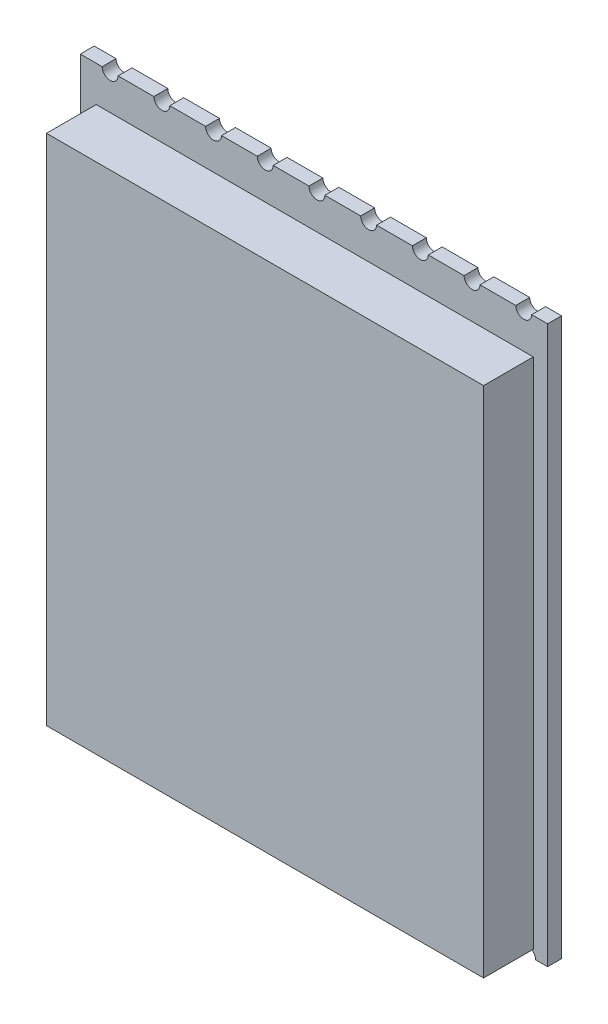
ISO-10303-21;
HEADER;
FILE_DESCRIPTION(('STEP AP214'),'2;1');
FILE_NAME('part.step','',(''),(''),'','','');
FILE_SCHEMA(('AUTOMOTIVE_DESIGN { 1 0 10303 214 1 1 1 1 }'));
ENDSEC;
DATA;
#1=APPLICATION_CONTEXT('core data for automotive mechanical design processes');
#2=APPLICATION_PROTOCOL_DEFINITION('international standard','automotive_design',2000,#1);
#3=PRODUCT_CONTEXT('',#1,'mechanical');
#4=PRODUCT('Part','Part','',(#3));
#5=PRODUCT_RELATED_PRODUCT_CATEGORY('part','',(#4));
#6=PRODUCT_DEFINITION_FORMATION('','',#4);
#7=PRODUCT_DEFINITION_CONTEXT('part definition',#1,'design');
#8=PRODUCT_DEFINITION('design','',#6,#7);
#9=PRODUCT_DEFINITION_SHAPE('','',#8);
#10=(LENGTH_UNIT() NAMED_UNIT(*) SI_UNIT(.MILLI.,.METRE.));
#11=(NAMED_UNIT(*) PLANE_ANGLE_UNIT() SI_UNIT($,.RADIAN.));
#12=(NAMED_UNIT(*) SI_UNIT($,.STERADIAN.) SOLID_ANGLE_UNIT());
#13=UNCERTAINTY_MEASURE_WITH_UNIT(LENGTH_MEASURE(1.E-05),#10,'distance_accuracy_value','');
#14=(GEOMETRIC_REPRESENTATION_CONTEXT(3) GLOBAL_UNCERTAINTY_ASSIGNED_CONTEXT((#13)) GLOBAL_UNIT_ASSIGNED_CONTEXT((#10,
#11,#12)) REPRESENTATION_CONTEXT('',''));
#15=CARTESIAN_POINT('',(0.,0.,0.));
#16=DIRECTION('',(0.,0.,1.));
#17=DIRECTION('',(1.,0.,0.));
#18=AXIS2_PLACEMENT_3D('',#15,#16,#17);
#19=CARTESIAN_POINT('',(0.,0.,3.2));
#20=DIRECTION('',(0.,0.,1.));
#21=DIRECTION('',(1.,0.,0.));
#22=AXIS2_PLACEMENT_3D('',#19,#20,#21);
#23=PLANE('',#22);
#24=DIRECTION('',(0.,-1.,0.));
#25=VECTOR('',#24,1.);
#26=CARTESIAN_POINT('',(22.78,26.2,3.2));
#27=LINE('',#26,#25);
#28=CARTESIAN_POINT('',(22.78,0.400000000000001,3.2));
#29=VERTEX_POINT('',#28);
#30=CARTESIAN_POINT('',(22.78,26.2,3.2));
#31=VERTEX_POINT('',#30);
#32=EDGE_CURVE('E561',#29,#31,#27,.F.);
#33=ORIENTED_EDGE('',*,*,#32,.T.);
#34=DIRECTION('',(1.,0.,0.));
#35=VECTOR('',#34,1.);
#36=CARTESIAN_POINT('',(0.8,26.2,3.2));
#37=LINE('',#36,#35);
#38=CARTESIAN_POINT('',(0.8,26.2,3.2));
#39=VERTEX_POINT('',#38);
#40=EDGE_CURVE('E550',#31,#39,#37,.F.);
#41=ORIENTED_EDGE('',*,*,#40,.T.);
#42=DIRECTION('',(0.,1.,0.));
#43=VECTOR('',#42,1.);
#44=CARTESIAN_POINT('',(0.8,26.2,3.2));
#45=LINE('',#44,#43);
#46=CARTESIAN_POINT('',(0.800000000000001,0.4,3.2));
#47=VERTEX_POINT('',#46);
#48=EDGE_CURVE('E538',#39,#47,#45,.F.);
#49=ORIENTED_EDGE('',*,*,#48,.T.);
#50=DIRECTION('',(-1.,0.,0.));
#51=VECTOR('',#50,1.);
#52=CARTESIAN_POINT('',(0.8,0.4,3.2));
#53=LINE('',#52,#51);
#54=EDGE_CURVE('E260',#47,#29,#53,.F.);
#55=ORIENTED_EDGE('',*,*,#54,.T.);
#56=EDGE_LOOP('',(#33,#41,#49,#55));
#57=FACE_BOUND('',#56,.T.);
#58=ADVANCED_FACE('F17',(#57),#23,.T.);
#59=CARTESIAN_POINT('',(22.78,26.2,3.2));
#60=DIRECTION('',(-1.,0.,0.));
#61=DIRECTION('',(0.,-1.,0.));
#62=AXIS2_PLACEMENT_3D('',#59,#60,#61);
#63=PLANE('',#62);
#64=DIRECTION('',(0.,0.,1.));
#65=VECTOR('',#64,1.);
#66=CARTESIAN_POINT('',(22.78,26.2,3.2));
#67=LINE('',#66,#65);
#68=CARTESIAN_POINT('',(22.78,26.2,0.7));
#69=VERTEX_POINT('',#68);
#70=EDGE_CURVE('E557',#69,#31,#67,.T.);
#71=ORIENTED_EDGE('',*,*,#70,.T.);
#72=ORIENTED_EDGE('',*,*,#32,.F.);
#73=DIRECTION('',(0.,0.,1.));
#74=VECTOR('',#73,1.);
#75=CARTESIAN_POINT('',(22.78,0.400000000000001,3.2));
#76=LINE('',#75,#74);
#77=CARTESIAN_POINT('',(22.78,0.4,0.7));
#78=VERTEX_POINT('',#77);
#79=EDGE_CURVE('E493',#29,#78,#76,.F.);
#80=ORIENTED_EDGE('',*,*,#79,.T.);
#81=DIRECTION('',(0.,1.,0.));
#82=VECTOR('',#81,1.);
#83=CARTESIAN_POINT('',(22.78,0.,0.7));
#84=LINE('',#83,#82);
#85=EDGE_CURVE('E488',#78,#69,#84,.T.);
#86=ORIENTED_EDGE('',*,*,#85,.T.);
#87=EDGE_LOOP('',(#71,#72,#80,#86));
#88=FACE_BOUND('',#87,.T.);
#89=ADVANCED_FACE('F875',(#88),#63,.F.);
#90=CARTESIAN_POINT('',(0.8,26.2,3.2));
#91=DIRECTION('',(0.,-1.,0.));
#92=DIRECTION('',(1.,0.,0.));
#93=AXIS2_PLACEMENT_3D('',#90,#91,#92);
#94=PLANE('',#93);
#95=DIRECTION('',(0.,0.,1.));
#96=VECTOR('',#95,1.);
#97=CARTESIAN_POINT('',(0.8,26.2,3.2));
#98=LINE('',#97,#96);
#99=CARTESIAN_POINT('',(0.8,26.2,0.7));
#100=VERTEX_POINT('',#99);
#101=EDGE_CURVE('E546',#100,#39,#98,.T.);
#102=ORIENTED_EDGE('',*,*,#101,.T.);
#103=ORIENTED_EDGE('',*,*,#40,.F.);
#104=ORIENTED_EDGE('',*,*,#70,.F.);
#105=DIRECTION('',(-1.,0.,0.));
#106=VECTOR('',#105,1.);
#107=CARTESIAN_POINT('',(0.,26.2,0.7));
#108=LINE('',#107,#106);
#109=EDGE_CURVE('E543',#69,#100,#108,.T.);
#110=ORIENTED_EDGE('',*,*,#109,.T.);
#111=EDGE_LOOP('',(#102,#103,#104,#110));
#112=FACE_BOUND('',#111,.T.);
#113=ADVANCED_FACE('F879',(#112),#94,.F.);
#114=CARTESIAN_POINT('',(0.8,26.2,3.2));
#115=DIRECTION('',(1.,0.,0.));
#116=DIRECTION('',(0.,1.,0.));
#117=AXIS2_PLACEMENT_3D('',#114,#115,#116);
#118=PLANE('',#117);
#119=DIRECTION('',(0.,0.,1.));
#120=VECTOR('',#119,1.);
#121=CARTESIAN_POINT('',(0.8,0.4,3.2));
#122=LINE('',#121,#120);
#123=CARTESIAN_POINT('',(0.8,0.4,0.7));
#124=VERTEX_POINT('',#123);
#125=EDGE_CURVE('E534',#124,#47,#122,.T.);
#126=ORIENTED_EDGE('',*,*,#125,.T.);
#127=ORIENTED_EDGE('',*,*,#48,.F.);
#128=ORIENTED_EDGE('',*,*,#101,.F.);
#129=DIRECTION('',(0.,1.,0.));
#130=VECTOR('',#129,1.);
#131=CARTESIAN_POINT('',(0.8,0.,0.7));
#132=LINE('',#131,#130);
#133=EDGE_CURVE('E481',#100,#124,#132,.F.);
#134=ORIENTED_EDGE('',*,*,#133,.T.);
#135=EDGE_LOOP('',(#126,#127,#128,#134));
#136=FACE_BOUND('',#135,.T.);
#137=ADVANCED_FACE('F871',(#136),#118,.F.);
#138=CARTESIAN_POINT('',(0.8,0.4,3.2));
#139=DIRECTION('',(0.,1.,0.));
#140=DIRECTION('',(-1.,0.,0.));
#141=AXIS2_PLACEMENT_3D('',#138,#139,#140);
#142=PLANE('',#141);
#143=DIRECTION('',(-1.,0.,0.));
#144=VECTOR('',#143,1.);
#145=CARTESIAN_POINT('',(0.,0.4,0.7));
#146=LINE('',#145,#144);
#147=CARTESIAN_POINT('',(17.3,0.4,0.7));
#148=VERTEX_POINT('',#147);
#149=CARTESIAN_POINT('',(19.9,0.4,0.7));
#150=VERTEX_POINT('',#149);
#151=EDGE_CURVE('E449',#148,#150,#146,.F.);
#152=ORIENTED_EDGE('',*,*,#151,.T.);
#153=DIRECTION('',(-1.,0.,0.));
#154=VECTOR('',#153,1.);
#155=CARTESIAN_POINT('',(0.,0.4,0.7));
#156=LINE('',#155,#154);
#157=CARTESIAN_POINT('',(22.5,0.4,0.7));
#158=VERTEX_POINT('',#157);
#159=EDGE_CURVE('E454',#150,#158,#156,.F.);
#160=ORIENTED_EDGE('',*,*,#159,.T.);
#161=DIRECTION('',(-1.,0.,0.));
#162=VECTOR('',#161,1.);
#163=CARTESIAN_POINT('',(0.,0.4,0.7));
#164=LINE('',#163,#162);
#165=EDGE_CURVE('E484',#158,#78,#164,.F.);
#166=ORIENTED_EDGE('',*,*,#165,.T.);
#167=ORIENTED_EDGE('',*,*,#79,.F.);
#168=ORIENTED_EDGE('',*,*,#54,.F.);
#169=ORIENTED_EDGE('',*,*,#125,.F.);
#170=DIRECTION('',(-1.,0.,0.));
#171=VECTOR('',#170,1.);
#172=CARTESIAN_POINT('',(0.,0.4,0.7));
#173=LINE('',#172,#171);
#174=EDGE_CURVE('E478',#124,#148,#173,.F.);
#175=ORIENTED_EDGE('',*,*,#174,.T.);
#176=EDGE_LOOP('',(#152,#160,#166,#167,#168,#169,#175));
#177=FACE_BOUND('',#176,.T.);
#178=ADVANCED_FACE('F679',(#177),#142,.F.);
#179=CARTESIAN_POINT('',(0.,0.,0.7));
#180=DIRECTION('',(0.,0.,-1.));
#181=DIRECTION('',(-1.,0.,0.));
#182=AXIS2_PLACEMENT_3D('',#179,#180,#181);
#183=PLANE('',#182);
#184=CARTESIAN_POINT('',(17.3,0.,0.7));
#185=DIRECTION('',(0.,0.,1.));
#186=DIRECTION('',(1.,0.,0.));
#187=AXIS2_PLACEMENT_3D('',#184,#185,#186);
#188=CIRCLE('',#187,0.4);
#189=CARTESIAN_POINT('',(16.9,0.,0.7));
#190=VERTEX_POINT('',#189);
#191=EDGE_CURVE('E453',#190,#148,#188,.F.);
#192=ORIENTED_EDGE('',*,*,#191,.T.);
#193=ORIENTED_EDGE('',*,*,#174,.F.);
#194=ORIENTED_EDGE('',*,*,#133,.F.);
#195=ORIENTED_EDGE('',*,*,#109,.F.);
#196=ORIENTED_EDGE('',*,*,#85,.F.);
#197=ORIENTED_EDGE('',*,*,#165,.F.);
#198=CARTESIAN_POINT('',(22.5,0.,0.7));
#199=DIRECTION('',(0.,0.,1.));
#200=DIRECTION('',(1.,0.,0.));
#201=AXIS2_PLACEMENT_3D('',#198,#199,#200);
#202=CIRCLE('',#201,0.4);
#203=CARTESIAN_POINT('',(22.9,0.,0.7));
#204=VERTEX_POINT('',#203);
#205=EDGE_CURVE('E20',#204,#158,#202,.T.);
#206=ORIENTED_EDGE('',*,*,#205,.F.);
#207=DIRECTION('',(-1.,0.,0.));
#208=VECTOR('',#207,1.);
#209=CARTESIAN_POINT('',(0.,0.,0.7));
#210=LINE('',#209,#208);
#211=CARTESIAN_POINT('',(23.5,0.,0.7));
#212=VERTEX_POINT('',#211);
#213=EDGE_CURVE('E248',#212,#204,#210,.T.);
#214=ORIENTED_EDGE('',*,*,#213,.F.);
#215=DIRECTION('',(0.,1.,0.));
#216=VECTOR('',#215,1.);
#217=CARTESIAN_POINT('',(23.5,0.,0.7));
#218=LINE('',#217,#216);
#219=CARTESIAN_POINT('',(23.5,28.,0.7));
#220=VERTEX_POINT('',#219);
#221=EDGE_CURVE('E317',#212,#220,#218,.T.);
#222=ORIENTED_EDGE('',*,*,#221,.T.);
#223=DIRECTION('',(1.,0.,0.));
#224=VECTOR('',#223,1.);
#225=CARTESIAN_POINT('',(0.,28.,0.7));
#226=LINE('',#225,#224);
#227=CARTESIAN_POINT('',(22.7,28.,0.7));
#228=VERTEX_POINT('',#227);
#229=EDGE_CURVE('E356',#220,#228,#226,.F.);
#230=ORIENTED_EDGE('',*,*,#229,.T.);
#231=CARTESIAN_POINT('',(22.3,28.,0.7));
#232=DIRECTION('',(0.,0.,1.));
#233=DIRECTION('',(1.,0.,0.));
#234=AXIS2_PLACEMENT_3D('',#231,#232,#233);
#235=CIRCLE('',#234,0.4);
#236=CARTESIAN_POINT('',(21.9,28.,0.7));
#237=VERTEX_POINT('',#236);
#238=EDGE_CURVE('E360',#228,#237,#235,.F.);
#239=ORIENTED_EDGE('',*,*,#238,.T.);
#240=DIRECTION('',(1.,0.,0.));
#241=VECTOR('',#240,1.);
#242=CARTESIAN_POINT('',(0.,28.,0.7));
#243=LINE('',#242,#241);
#244=CARTESIAN_POINT('',(20.1,28.,0.7));
#245=VERTEX_POINT('',#244);
#246=EDGE_CURVE('E364',#237,#245,#243,.F.);
#247=ORIENTED_EDGE('',*,*,#246,.T.);
#248=CARTESIAN_POINT('',(19.7,28.,0.7));
#249=DIRECTION('',(0.,0.,1.));
#250=DIRECTION('',(1.,0.,0.));
#251=AXIS2_PLACEMENT_3D('',#248,#249,#250);
#252=CIRCLE('',#251,0.4);
#253=CARTESIAN_POINT('',(19.3,28.,0.7));
#254=VERTEX_POINT('',#253);
#255=EDGE_CURVE('E368',#245,#254,#252,.F.);
#256=ORIENTED_EDGE('',*,*,#255,.T.);
#257=DIRECTION('',(1.,0.,0.));
#258=VECTOR('',#257,1.);
#259=CARTESIAN_POINT('',(0.,28.,0.7));
#260=LINE('',#259,#258);
#261=CARTESIAN_POINT('',(17.5,28.,0.7));
#262=VERTEX_POINT('',#261);
#263=EDGE_CURVE('E372',#254,#262,#260,.F.);
#264=ORIENTED_EDGE('',*,*,#263,.T.);
#265=CARTESIAN_POINT('',(17.1,28.,0.7));
#266=DIRECTION('',(0.,0.,1.));
#267=DIRECTION('',(1.,0.,0.));
#268=AXIS2_PLACEMENT_3D('',#265,#266,#267);
#269=CIRCLE('',#268,0.4);
#270=CARTESIAN_POINT('',(16.7,28.,0.7));
#271=VERTEX_POINT('',#270);
#272=EDGE_CURVE('E376',#262,#271,#269,.F.);
#273=ORIENTED_EDGE('',*,*,#272,.T.);
#274=DIRECTION('',(1.,0.,0.));
#275=VECTOR('',#274,1.);
#276=CARTESIAN_POINT('',(0.,28.,0.7));
#277=LINE('',#276,#275);
#278=CARTESIAN_POINT('',(14.9,28.,0.7));
#279=VERTEX_POINT('',#278);
#280=EDGE_CURVE('E380',#271,#279,#277,.F.);
#281=ORIENTED_EDGE('',*,*,#280,.T.);
#282=CARTESIAN_POINT('',(14.5,28.,0.7));
#283=DIRECTION('',(0.,0.,1.));
#284=DIRECTION('',(1.,0.,0.));
#285=AXIS2_PLACEMENT_3D('',#282,#283,#284);
#286=CIRCLE('',#285,0.4);
#287=CARTESIAN_POINT('',(14.1,28.,0.7));
#288=VERTEX_POINT('',#287);
#289=EDGE_CURVE('E384',#279,#288,#286,.F.);
#290=ORIENTED_EDGE('',*,*,#289,.T.);
#291=DIRECTION('',(1.,0.,0.));
#292=VECTOR('',#291,1.);
#293=CARTESIAN_POINT('',(0.,28.,0.7));
#294=LINE('',#293,#292);
#295=CARTESIAN_POINT('',(12.3,28.,0.7));
#296=VERTEX_POINT('',#295);
#297=EDGE_CURVE('E388',#288,#296,#294,.F.);
#298=ORIENTED_EDGE('',*,*,#297,.T.);
#299=CARTESIAN_POINT('',(11.9,28.,0.7));
#300=DIRECTION('',(0.,0.,1.));
#301=DIRECTION('',(1.,0.,0.));
#302=AXIS2_PLACEMENT_3D('',#299,#300,#301);
#303=CIRCLE('',#302,0.4);
#304=CARTESIAN_POINT('',(11.5,28.,0.7));
#305=VERTEX_POINT('',#304);
#306=EDGE_CURVE('E392',#296,#305,#303,.F.);
#307=ORIENTED_EDGE('',*,*,#306,.T.);
#308=DIRECTION('',(1.,0.,0.));
#309=VECTOR('',#308,1.);
#310=CARTESIAN_POINT('',(0.,28.,0.7));
#311=LINE('',#310,#309);
#312=CARTESIAN_POINT('',(9.7,28.,0.7));
#313=VERTEX_POINT('',#312);
#314=EDGE_CURVE('E396',#305,#313,#311,.F.);
#315=ORIENTED_EDGE('',*,*,#314,.T.);
#316=CARTESIAN_POINT('',(9.3,28.,0.7));
#317=DIRECTION('',(0.,0.,1.));
#318=DIRECTION('',(1.,0.,0.));
#319=AXIS2_PLACEMENT_3D('',#316,#317,#318);
#320=CIRCLE('',#319,0.4);
#321=CARTESIAN_POINT('',(8.9,28.,0.7));
#322=VERTEX_POINT('',#321);
#323=EDGE_CURVE('E400',#313,#322,#320,.F.);
#324=ORIENTED_EDGE('',*,*,#323,.T.);
#325=DIRECTION('',(1.,0.,0.));
#326=VECTOR('',#325,1.);
#327=CARTESIAN_POINT('',(0.,28.,0.7));
#328=LINE('',#327,#326);
#329=CARTESIAN_POINT('',(7.1,28.,0.7));
#330=VERTEX_POINT('',#329);
#331=EDGE_CURVE('E404',#322,#330,#328,.F.);
#332=ORIENTED_EDGE('',*,*,#331,.T.);
#333=CARTESIAN_POINT('',(6.7,28.,0.7));
#334=DIRECTION('',(0.,0.,1.));
#335=DIRECTION('',(1.,0.,0.));
#336=AXIS2_PLACEMENT_3D('',#333,#334,#335);
#337=CIRCLE('',#336,0.4);
#338=CARTESIAN_POINT('',(6.3,28.,0.7));
#339=VERTEX_POINT('',#338);
#340=EDGE_CURVE('E408',#330,#339,#337,.F.);
#341=ORIENTED_EDGE('',*,*,#340,.T.);
#342=DIRECTION('',(1.,0.,0.));
#343=VECTOR('',#342,1.);
#344=CARTESIAN_POINT('',(0.,28.,0.7));
#345=LINE('',#344,#343);
#346=CARTESIAN_POINT('',(4.5,28.,0.7));
#347=VERTEX_POINT('',#346);
#348=EDGE_CURVE('E412',#339,#347,#345,.F.);
#349=ORIENTED_EDGE('',*,*,#348,.T.);
#350=CARTESIAN_POINT('',(4.1,28.,0.7));
#351=DIRECTION('',(0.,0.,1.));
#352=DIRECTION('',(1.,0.,0.));
#353=AXIS2_PLACEMENT_3D('',#350,#351,#352);
#354=CIRCLE('',#353,0.4);
#355=CARTESIAN_POINT('',(3.7,28.,0.7));
#356=VERTEX_POINT('',#355);
#357=EDGE_CURVE('E416',#347,#356,#354,.F.);
#358=ORIENTED_EDGE('',*,*,#357,.T.);
#359=DIRECTION('',(1.,0.,0.));
#360=VECTOR('',#359,1.);
#361=CARTESIAN_POINT('',(0.,28.,0.7));
#362=LINE('',#361,#360);
#363=CARTESIAN_POINT('',(1.9,28.,0.7));
#364=VERTEX_POINT('',#363);
#365=EDGE_CURVE('E420',#356,#364,#362,.F.);
#366=ORIENTED_EDGE('',*,*,#365,.T.);
#367=CARTESIAN_POINT('',(1.5,28.,0.7));
#368=DIRECTION('',(0.,0.,1.));
#369=DIRECTION('',(1.,0.,0.));
#370=AXIS2_PLACEMENT_3D('',#367,#368,#369);
#371=CIRCLE('',#370,0.4);
#372=CARTESIAN_POINT('',(1.1,28.,0.7));
#373=VERTEX_POINT('',#372);
#374=EDGE_CURVE('E424',#364,#373,#371,.F.);
#375=ORIENTED_EDGE('',*,*,#374,.T.);
#376=DIRECTION('',(1.,0.,0.));
#377=VECTOR('',#376,1.);
#378=CARTESIAN_POINT('',(0.,28.,0.7));
#379=LINE('',#378,#377);
#380=CARTESIAN_POINT('',(0.,28.,0.7));
#381=VERTEX_POINT('',#380);
#382=EDGE_CURVE('E428',#373,#381,#379,.F.);
#383=ORIENTED_EDGE('',*,*,#382,.T.);
#384=DIRECTION('',(0.,1.,0.));
#385=VECTOR('',#384,1.);
#386=CARTESIAN_POINT('',(0.,0.,0.7));
#387=LINE('',#386,#385);
#388=CARTESIAN_POINT('',(0.,0.,0.7));
#389=VERTEX_POINT('',#388);
#390=EDGE_CURVE('E442',#381,#389,#387,.F.);
#391=ORIENTED_EDGE('',*,*,#390,.T.);
#392=DIRECTION('',(1.,0.,0.));
#393=VECTOR('',#392,1.);
#394=CARTESIAN_POINT('',(0.,0.,0.7));
#395=LINE('',#394,#393);
#396=EDGE_CURVE('E448',#389,#190,#395,.T.);
#397=ORIENTED_EDGE('',*,*,#396,.T.);
#398=EDGE_LOOP('',(#192,#193,#194,#195,#196,#197,#206,#214,#222,#230,#239,#247,#256,#264,#273,
#281,#290,#298,#307,#315,#324,#332,#341,#349,#358,#366,#375,#383,#391,#397));
#399=FACE_BOUND('',#398,.T.);
#400=ADVANCED_FACE('F865',(#399),#183,.F.);
#401=CARTESIAN_POINT('',(0.,0.,0.7));
#402=DIRECTION('',(0.,0.,-1.));
#403=DIRECTION('',(-1.,0.,0.));
#404=AXIS2_PLACEMENT_3D('',#401,#402,#403);
#405=PLANE('',#404);
#406=CARTESIAN_POINT('',(19.9,0.,0.7));
#407=DIRECTION('',(0.,0.,1.));
#408=DIRECTION('',(1.,0.,0.));
#409=AXIS2_PLACEMENT_3D('',#406,#407,#408);
#410=CIRCLE('',#409,0.4);
#411=CARTESIAN_POINT('',(20.3,0.,0.7));
#412=VERTEX_POINT('',#411);
#413=EDGE_CURVE('E470',#412,#150,#410,.T.);
#414=ORIENTED_EDGE('',*,*,#413,.F.);
#415=DIRECTION('',(1.,0.,0.));
#416=VECTOR('',#415,1.);
#417=CARTESIAN_POINT('',(0.,0.,0.7));
#418=LINE('',#417,#416);
#419=CARTESIAN_POINT('',(22.1,0.,0.7));
#420=VERTEX_POINT('',#419);
#421=EDGE_CURVE('E461',#412,#420,#418,.T.);
#422=ORIENTED_EDGE('',*,*,#421,.T.);
#423=CARTESIAN_POINT('',(22.5,0.,0.7));
#424=DIRECTION('',(0.,0.,1.));
#425=DIRECTION('',(1.,0.,0.));
#426=AXIS2_PLACEMENT_3D('',#423,#424,#425);
#427=CIRCLE('',#426,0.4);
#428=EDGE_CURVE('E319',#420,#158,#427,.F.);
#429=ORIENTED_EDGE('',*,*,#428,.T.);
#430=ORIENTED_EDGE('',*,*,#159,.F.);
#431=EDGE_LOOP('',(#414,#422,#429,#430));
#432=FACE_BOUND('',#431,.T.);
#433=ADVANCED_FACE('F683',(#432),#405,.F.);
#434=CARTESIAN_POINT('',(0.,0.,0.7));
#435=DIRECTION('',(0.,0.,-1.));
#436=DIRECTION('',(-1.,0.,0.));
#437=AXIS2_PLACEMENT_3D('',#434,#435,#436);
#438=PLANE('',#437);
#439=CARTESIAN_POINT('',(17.3,0.,0.7));
#440=DIRECTION('',(0.,0.,1.));
#441=DIRECTION('',(1.,0.,0.));
#442=AXIS2_PLACEMENT_3D('',#439,#440,#441);
#443=CIRCLE('',#442,0.4);
#444=CARTESIAN_POINT('',(17.7,0.,0.7));
#445=VERTEX_POINT('',#444);
#446=EDGE_CURVE('E531',#148,#445,#443,.F.);
#447=ORIENTED_EDGE('',*,*,#446,.T.);
#448=DIRECTION('',(1.,0.,0.));
#449=VECTOR('',#448,1.);
#450=CARTESIAN_POINT('',(0.,0.,0.7));
#451=LINE('',#450,#449);
#452=CARTESIAN_POINT('',(19.5,0.,0.7));
#453=VERTEX_POINT('',#452);
#454=EDGE_CURVE('E455',#445,#453,#451,.T.);
#455=ORIENTED_EDGE('',*,*,#454,.T.);
#456=CARTESIAN_POINT('',(19.9,0.,0.7));
#457=DIRECTION('',(0.,0.,1.));
#458=DIRECTION('',(1.,0.,0.));
#459=AXIS2_PLACEMENT_3D('',#456,#457,#458);
#460=CIRCLE('',#459,0.4);
#461=EDGE_CURVE('E465',#453,#150,#460,.F.);
#462=ORIENTED_EDGE('',*,*,#461,.T.);
#463=ORIENTED_EDGE('',*,*,#151,.F.);
#464=EDGE_LOOP('',(#447,#455,#462,#463));
#465=FACE_BOUND('',#464,.T.);
#466=ADVANCED_FACE('F675',(#465),#438,.F.);
#467=CARTESIAN_POINT('',(17.3,0.,-1.8));
#468=DIRECTION('',(0.,0.,1.));
#469=DIRECTION('',(1.,0.,0.));
#470=AXIS2_PLACEMENT_3D('',#467,#468,#469);
#471=CYLINDRICAL_SURFACE('',#470,0.4);
#472=DIRECTION('',(0.,0.,1.));
#473=VECTOR('',#472,1.);
#474=CARTESIAN_POINT('',(17.7,0.,0.7));
#475=LINE('',#474,#473);
#476=CARTESIAN_POINT('',(17.7,0.,0.));
#477=VERTEX_POINT('',#476);
#478=EDGE_CURVE('E460',#477,#445,#475,.T.);
#479=ORIENTED_EDGE('',*,*,#478,.T.);
#480=ORIENTED_EDGE('',*,*,#446,.F.);
#481=ORIENTED_EDGE('',*,*,#191,.F.);
#482=DIRECTION('',(0.,0.,1.));
#483=VECTOR('',#482,1.);
#484=CARTESIAN_POINT('',(16.9,0.,0.7));
#485=LINE('',#484,#483);
#486=CARTESIAN_POINT('',(16.9,0.,0.));
#487=VERTEX_POINT('',#486);
#488=EDGE_CURVE('E445',#190,#487,#485,.F.);
#489=ORIENTED_EDGE('',*,*,#488,.T.);
#490=CARTESIAN_POINT('',(17.3,0.,0.));
#491=DIRECTION('',(0.,0.,1.));
#492=DIRECTION('',(1.,0.,0.));
#493=AXIS2_PLACEMENT_3D('',#490,#491,#492);
#494=CIRCLE('',#493,0.4);
#495=EDGE_CURVE('E459',#477,#487,#494,.T.);
#496=ORIENTED_EDGE('',*,*,#495,.F.);
#497=EDGE_LOOP('',(#479,#480,#481,#489,#496));
#498=FACE_BOUND('',#497,.T.);
#499=ADVANCED_FACE('F769',(#498),#471,.F.);
#500=CARTESIAN_POINT('',(0.,0.,0.7));
#501=DIRECTION('',(0.,1.,0.));
#502=DIRECTION('',(0.,0.,1.));
#503=AXIS2_PLACEMENT_3D('',#500,#501,#502);
#504=PLANE('',#503);
#505=ORIENTED_EDGE('',*,*,#488,.F.);
#506=ORIENTED_EDGE('',*,*,#396,.F.);
#507=DIRECTION('',(0.,0.,-1.));
#508=VECTOR('',#507,1.);
#509=CARTESIAN_POINT('',(0.,0.,0.7));
#510=LINE('',#509,#508);
#511=CARTESIAN_POINT('',(0.,0.,0.));
#512=VERTEX_POINT('',#511);
#513=EDGE_CURVE('E429',#389,#512,#510,.T.);
#514=ORIENTED_EDGE('',*,*,#513,.T.);
#515=DIRECTION('',(-1.,0.,0.));
#516=VECTOR('',#515,1.);
#517=CARTESIAN_POINT('',(0.,0.,0.));
#518=LINE('',#517,#516);
#519=EDGE_CURVE('E437',#487,#512,#518,.T.);
#520=ORIENTED_EDGE('',*,*,#519,.F.);
#521=EDGE_LOOP('',(#505,#506,#514,#520));
#522=FACE_BOUND('',#521,.T.);
#523=ADVANCED_FACE('F774',(#522),#504,.F.);
#524=CARTESIAN_POINT('',(0.,0.,0.7));
#525=DIRECTION('',(1.,0.,0.));
#526=DIRECTION('',(0.,0.,-1.));
#527=AXIS2_PLACEMENT_3D('',#524,#525,#526);
#528=PLANE('',#527);
#529=ORIENTED_EDGE('',*,*,#513,.F.);
#530=ORIENTED_EDGE('',*,*,#390,.F.);
#531=DIRECTION('',(0.,0.,-1.));
#532=VECTOR('',#531,1.);
#533=CARTESIAN_POINT('',(0.,28.,0.7));
#534=LINE('',#533,#532);
#535=CARTESIAN_POINT('',(0.,28.,0.));
#536=VERTEX_POINT('',#535);
#537=EDGE_CURVE('E425',#381,#536,#534,.T.);
#538=ORIENTED_EDGE('',*,*,#537,.T.);
#539=DIRECTION('',(0.,1.,0.));
#540=VECTOR('',#539,1.);
#541=CARTESIAN_POINT('',(0.,0.,0.));
#542=LINE('',#541,#540);
#543=EDGE_CURVE('E432',#512,#536,#542,.T.);
#544=ORIENTED_EDGE('',*,*,#543,.F.);
#545=EDGE_LOOP('',(#529,#530,#538,#544));
#546=FACE_BOUND('',#545,.T.);
#547=ADVANCED_FACE('F778',(#546),#528,.F.);
#548=CARTESIAN_POINT('',(0.,28.,0.7));
#549=DIRECTION('',(0.,-1.,0.));
#550=DIRECTION('',(0.,0.,-1.));
#551=AXIS2_PLACEMENT_3D('',#548,#549,#550);
#552=PLANE('',#551);
#553=DIRECTION('',(0.,0.,1.));
#554=VECTOR('',#553,1.);
#555=CARTESIAN_POINT('',(1.1,28.,-1.8));
#556=LINE('',#555,#554);
#557=CARTESIAN_POINT('',(1.1,28.,0.));
#558=VERTEX_POINT('',#557);
#559=EDGE_CURVE('E421',#373,#558,#556,.F.);
#560=ORIENTED_EDGE('',*,*,#559,.T.);
#561=DIRECTION('',(-1.,0.,0.));
#562=VECTOR('',#561,1.);
#563=CARTESIAN_POINT('',(0.,28.,0.));
#564=LINE('',#563,#562);
#565=EDGE_CURVE('E436',#536,#558,#564,.F.);
#566=ORIENTED_EDGE('',*,*,#565,.F.);
#567=ORIENTED_EDGE('',*,*,#537,.F.);
#568=ORIENTED_EDGE('',*,*,#382,.F.);
#569=EDGE_LOOP('',(#560,#566,#567,#568));
#570=FACE_BOUND('',#569,.T.);
#571=ADVANCED_FACE('F783',(#570),#552,.F.);
#572=CARTESIAN_POINT('',(1.5,28.,-1.8));
#573=DIRECTION('',(0.,0.,1.));
#574=DIRECTION('',(1.,0.,0.));
#575=AXIS2_PLACEMENT_3D('',#572,#573,#574);
#576=CYLINDRICAL_SURFACE('',#575,0.4);
#577=ORIENTED_EDGE('',*,*,#559,.F.);
#578=ORIENTED_EDGE('',*,*,#374,.F.);
#579=DIRECTION('',(0.,0.,-1.));
#580=VECTOR('',#579,1.);
#581=CARTESIAN_POINT('',(1.9,28.,0.7));
#582=LINE('',#581,#580);
#583=CARTESIAN_POINT('',(1.9,28.,0.));
#584=VERTEX_POINT('',#583);
#585=EDGE_CURVE('E417',#364,#584,#582,.T.);
#586=ORIENTED_EDGE('',*,*,#585,.T.);
#587=CARTESIAN_POINT('',(1.5,28.,0.));
#588=DIRECTION('',(0.,0.,1.));
#589=DIRECTION('',(1.,0.,0.));
#590=AXIS2_PLACEMENT_3D('',#587,#588,#589);
#591=CIRCLE('',#590,0.4);
#592=EDGE_CURVE('E631',#558,#584,#591,.T.);
#593=ORIENTED_EDGE('',*,*,#592,.F.);
#594=EDGE_LOOP('',(#577,#578,#586,#593));
#595=FACE_BOUND('',#594,.T.);
#596=ADVANCED_FACE('F787',(#595),#576,.F.);
#597=CARTESIAN_POINT('',(0.,28.,0.7));
#598=DIRECTION('',(0.,-1.,0.));
#599=DIRECTION('',(0.,0.,-1.));
#600=AXIS2_PLACEMENT_3D('',#597,#598,#599);
#601=PLANE('',#600);
#602=DIRECTION('',(0.,0.,1.));
#603=VECTOR('',#602,1.);
#604=CARTESIAN_POINT('',(3.7,28.,-1.8));
#605=LINE('',#604,#603);
#606=CARTESIAN_POINT('',(3.7,28.,0.));
#607=VERTEX_POINT('',#606);
#608=EDGE_CURVE('E413',#356,#607,#605,.F.);
#609=ORIENTED_EDGE('',*,*,#608,.T.);
#610=DIRECTION('',(-1.,0.,0.));
#611=VECTOR('',#610,1.);
#612=CARTESIAN_POINT('',(0.,28.,0.));
#613=LINE('',#612,#611);
#614=EDGE_CURVE('E630',#584,#607,#613,.F.);
#615=ORIENTED_EDGE('',*,*,#614,.F.);
#616=ORIENTED_EDGE('',*,*,#585,.F.);
#617=ORIENTED_EDGE('',*,*,#365,.F.);
#618=EDGE_LOOP('',(#609,#615,#616,#617));
#619=FACE_BOUND('',#618,.T.);
#620=ADVANCED_FACE('F792',(#619),#601,.F.);
#621=CARTESIAN_POINT('',(4.1,28.,-1.8));
#622=DIRECTION('',(0.,0.,1.));
#623=DIRECTION('',(1.,0.,0.));
#624=AXIS2_PLACEMENT_3D('',#621,#622,#623);
#625=CYLINDRICAL_SURFACE('',#624,0.4);
#626=ORIENTED_EDGE('',*,*,#608,.F.);
#627=ORIENTED_EDGE('',*,*,#357,.F.);
#628=DIRECTION('',(0.,0.,-1.));
#629=VECTOR('',#628,1.);
#630=CARTESIAN_POINT('',(4.5,28.,0.7));
#631=LINE('',#630,#629);
#632=CARTESIAN_POINT('',(4.5,28.,0.));
#633=VERTEX_POINT('',#632);
#634=EDGE_CURVE('E409',#347,#633,#631,.T.);
#635=ORIENTED_EDGE('',*,*,#634,.T.);
#636=CARTESIAN_POINT('',(4.1,28.,0.));
#637=DIRECTION('',(0.,0.,1.));
#638=DIRECTION('',(1.,0.,0.));
#639=AXIS2_PLACEMENT_3D('',#636,#637,#638);
#640=CIRCLE('',#639,0.4);
#641=EDGE_CURVE('E626',#607,#633,#640,.T.);
#642=ORIENTED_EDGE('',*,*,#641,.F.);
#643=EDGE_LOOP('',(#626,#627,#635,#642));
#644=FACE_BOUND('',#643,.T.);
#645=ADVANCED_FACE('F797',(#644),#625,.F.);
#646=CARTESIAN_POINT('',(0.,28.,0.7));
#647=DIRECTION('',(0.,-1.,0.));
#648=DIRECTION('',(0.,0.,-1.));
#649=AXIS2_PLACEMENT_3D('',#646,#647,#648);
#650=PLANE('',#649);
#651=DIRECTION('',(0.,0.,1.));
#652=VECTOR('',#651,1.);
#653=CARTESIAN_POINT('',(6.3,28.,-1.8));
#654=LINE('',#653,#652);
#655=CARTESIAN_POINT('',(6.3,28.,0.));
#656=VERTEX_POINT('',#655);
#657=EDGE_CURVE('E405',#339,#656,#654,.F.);
#658=ORIENTED_EDGE('',*,*,#657,.T.);
#659=DIRECTION('',(-1.,0.,0.));
#660=VECTOR('',#659,1.);
#661=CARTESIAN_POINT('',(0.,28.,0.));
#662=LINE('',#661,#660);
#663=EDGE_CURVE('E625',#633,#656,#662,.F.);
#664=ORIENTED_EDGE('',*,*,#663,.F.);
#665=ORIENTED_EDGE('',*,*,#634,.F.);
#666=ORIENTED_EDGE('',*,*,#348,.F.);
#667=EDGE_LOOP('',(#658,#664,#665,#666));
#668=FACE_BOUND('',#667,.T.);
#669=ADVANCED_FACE('F801',(#668),#650,.F.);
#670=CARTESIAN_POINT('',(6.7,28.,-1.8));
#671=DIRECTION('',(0.,0.,1.));
#672=DIRECTION('',(1.,0.,0.));
#673=AXIS2_PLACEMENT_3D('',#670,#671,#672);
#674=CYLINDRICAL_SURFACE('',#673,0.4);
#675=ORIENTED_EDGE('',*,*,#657,.F.);
#676=ORIENTED_EDGE('',*,*,#340,.F.);
#677=DIRECTION('',(0.,0.,-1.));
#678=VECTOR('',#677,1.);
#679=CARTESIAN_POINT('',(7.1,28.,0.7));
#680=LINE('',#679,#678);
#681=CARTESIAN_POINT('',(7.1,28.,0.));
#682=VERTEX_POINT('',#681);
#683=EDGE_CURVE('E401',#330,#682,#680,.T.);
#684=ORIENTED_EDGE('',*,*,#683,.T.);
#685=CARTESIAN_POINT('',(6.7,28.,0.));
#686=DIRECTION('',(0.,0.,1.));
#687=DIRECTION('',(1.,0.,0.));
#688=AXIS2_PLACEMENT_3D('',#685,#686,#687);
#689=CIRCLE('',#688,0.4);
#690=EDGE_CURVE('E621',#656,#682,#689,.T.);
#691=ORIENTED_EDGE('',*,*,#690,.F.);
#692=EDGE_LOOP('',(#675,#676,#684,#691));
#693=FACE_BOUND('',#692,.T.);
#694=ADVANCED_FACE('F805',(#693),#674,.F.);
#695=CARTESIAN_POINT('',(0.,28.,0.7));
#696=DIRECTION('',(0.,-1.,0.));
#697=DIRECTION('',(0.,0.,-1.));
#698=AXIS2_PLACEMENT_3D('',#695,#696,#697);
#699=PLANE('',#698);
#700=DIRECTION('',(0.,0.,1.));
#701=VECTOR('',#700,1.);
#702=CARTESIAN_POINT('',(8.9,28.,-1.8));
#703=LINE('',#702,#701);
#704=CARTESIAN_POINT('',(8.9,28.,0.));
#705=VERTEX_POINT('',#704);
#706=EDGE_CURVE('E397',#322,#705,#703,.F.);
#707=ORIENTED_EDGE('',*,*,#706,.T.);
#708=DIRECTION('',(-1.,0.,0.));
#709=VECTOR('',#708,1.);
#710=CARTESIAN_POINT('',(0.,28.,0.));
#711=LINE('',#710,#709);
#712=EDGE_CURVE('E620',#682,#705,#711,.F.);
#713=ORIENTED_EDGE('',*,*,#712,.F.);
#714=ORIENTED_EDGE('',*,*,#683,.F.);
#715=ORIENTED_EDGE('',*,*,#331,.F.);
#716=EDGE_LOOP('',(#707,#713,#714,#715));
#717=FACE_BOUND('',#716,.T.);
#718=ADVANCED_FACE('F810',(#717),#699,.F.);
#719=CARTESIAN_POINT('',(9.3,28.,-1.8));
#720=DIRECTION('',(0.,0.,1.));
#721=DIRECTION('',(1.,0.,0.));
#722=AXIS2_PLACEMENT_3D('',#719,#720,#721);
#723=CYLINDRICAL_SURFACE('',#722,0.4);
#724=ORIENTED_EDGE('',*,*,#706,.F.);
#725=ORIENTED_EDGE('',*,*,#323,.F.);
#726=DIRECTION('',(0.,0.,-1.));
#727=VECTOR('',#726,1.);
#728=CARTESIAN_POINT('',(9.7,28.,0.7));
#729=LINE('',#728,#727);
#730=CARTESIAN_POINT('',(9.7,28.,0.));
#731=VERTEX_POINT('',#730);
#732=EDGE_CURVE('E393',#313,#731,#729,.T.);
#733=ORIENTED_EDGE('',*,*,#732,.T.);
#734=CARTESIAN_POINT('',(9.3,28.,0.));
#735=DIRECTION('',(0.,0.,1.));
#736=DIRECTION('',(1.,0.,0.));
#737=AXIS2_PLACEMENT_3D('',#734,#735,#736);
#738=CIRCLE('',#737,0.4);
#739=EDGE_CURVE('E616',#705,#731,#738,.T.);
#740=ORIENTED_EDGE('',*,*,#739,.F.);
#741=EDGE_LOOP('',(#724,#725,#733,#740));
#742=FACE_BOUND('',#741,.T.);
#743=ADVANCED_FACE('F814',(#742),#723,.F.);
#744=CARTESIAN_POINT('',(0.,28.,0.7));
#745=DIRECTION('',(0.,-1.,0.));
#746=DIRECTION('',(0.,0.,-1.));
#747=AXIS2_PLACEMENT_3D('',#744,#745,#746);
#748=PLANE('',#747);
#749=DIRECTION('',(0.,0.,1.));
#750=VECTOR('',#749,1.);
#751=CARTESIAN_POINT('',(11.5,28.,-1.8));
#752=LINE('',#751,#750);
#753=CARTESIAN_POINT('',(11.5,28.,0.));
#754=VERTEX_POINT('',#753);
#755=EDGE_CURVE('E389',#305,#754,#752,.F.);
#756=ORIENTED_EDGE('',*,*,#755,.T.);
#757=DIRECTION('',(-1.,0.,0.));
#758=VECTOR('',#757,1.);
#759=CARTESIAN_POINT('',(0.,28.,0.));
#760=LINE('',#759,#758);
#761=EDGE_CURVE('E615',#731,#754,#760,.F.);
#762=ORIENTED_EDGE('',*,*,#761,.F.);
#763=ORIENTED_EDGE('',*,*,#732,.F.);
#764=ORIENTED_EDGE('',*,*,#314,.F.);
#765=EDGE_LOOP('',(#756,#762,#763,#764));
#766=FACE_BOUND('',#765,.T.);
#767=ADVANCED_FACE('F819',(#766),#748,.F.);
#768=CARTESIAN_POINT('',(11.9,28.,-1.8));
#769=DIRECTION('',(0.,0.,1.));
#770=DIRECTION('',(1.,0.,0.));
#771=AXIS2_PLACEMENT_3D('',#768,#769,#770);
#772=CYLINDRICAL_SURFACE('',#771,0.4);
#773=ORIENTED_EDGE('',*,*,#755,.F.);
#774=ORIENTED_EDGE('',*,*,#306,.F.);
#775=DIRECTION('',(0.,0.,-1.));
#776=VECTOR('',#775,1.);
#777=CARTESIAN_POINT('',(12.3,28.,0.7));
#778=LINE('',#777,#776);
#779=CARTESIAN_POINT('',(12.3,28.,0.));
#780=VERTEX_POINT('',#779);
#781=EDGE_CURVE('E385',#296,#780,#778,.T.);
#782=ORIENTED_EDGE('',*,*,#781,.T.);
#783=CARTESIAN_POINT('',(11.9,28.,0.));
#784=DIRECTION('',(0.,0.,1.));
#785=DIRECTION('',(1.,0.,0.));
#786=AXIS2_PLACEMENT_3D('',#783,#784,#785);
#787=CIRCLE('',#786,0.4);
#788=EDGE_CURVE('E611',#754,#780,#787,.T.);
#789=ORIENTED_EDGE('',*,*,#788,.F.);
#790=EDGE_LOOP('',(#773,#774,#782,#789));
#791=FACE_BOUND('',#790,.T.);
#792=ADVANCED_FACE('F824',(#791),#772,.F.);
#793=CARTESIAN_POINT('',(0.,28.,0.7));
#794=DIRECTION('',(0.,-1.,0.));
#795=DIRECTION('',(0.,0.,-1.));
#796=AXIS2_PLACEMENT_3D('',#793,#794,#795);
#797=PLANE('',#796);
#798=DIRECTION('',(0.,0.,1.));
#799=VECTOR('',#798,1.);
#800=CARTESIAN_POINT('',(14.1,28.,-1.8));
#801=LINE('',#800,#799);
#802=CARTESIAN_POINT('',(14.1,28.,0.));
#803=VERTEX_POINT('',#802);
#804=EDGE_CURVE('E381',#288,#803,#801,.F.);
#805=ORIENTED_EDGE('',*,*,#804,.T.);
#806=DIRECTION('',(-1.,0.,0.));
#807=VECTOR('',#806,1.);
#808=CARTESIAN_POINT('',(0.,28.,0.));
#809=LINE('',#808,#807);
#810=EDGE_CURVE('E610',#780,#803,#809,.F.);
#811=ORIENTED_EDGE('',*,*,#810,.F.);
#812=ORIENTED_EDGE('',*,*,#781,.F.);
#813=ORIENTED_EDGE('',*,*,#297,.F.);
#814=EDGE_LOOP('',(#805,#811,#812,#813));
#815=FACE_BOUND('',#814,.T.);
#816=ADVANCED_FACE('F828',(#815),#797,.F.);
#817=CARTESIAN_POINT('',(14.5,28.,-1.8));
#818=DIRECTION('',(0.,0.,1.));
#819=DIRECTION('',(1.,0.,0.));
#820=AXIS2_PLACEMENT_3D('',#817,#818,#819);
#821=CYLINDRICAL_SURFACE('',#820,0.4);
#822=ORIENTED_EDGE('',*,*,#804,.F.);
#823=ORIENTED_EDGE('',*,*,#289,.F.);
#824=DIRECTION('',(0.,0.,-1.));
#825=VECTOR('',#824,1.);
#826=CARTESIAN_POINT('',(14.9,28.,0.7));
#827=LINE('',#826,#825);
#828=CARTESIAN_POINT('',(14.9,28.,0.));
#829=VERTEX_POINT('',#828);
#830=EDGE_CURVE('E377',#279,#829,#827,.T.);
#831=ORIENTED_EDGE('',*,*,#830,.T.);
#832=CARTESIAN_POINT('',(14.5,28.,0.));
#833=DIRECTION('',(0.,0.,1.));
#834=DIRECTION('',(1.,0.,0.));
#835=AXIS2_PLACEMENT_3D('',#832,#833,#834);
#836=CIRCLE('',#835,0.4);
#837=EDGE_CURVE('E606',#803,#829,#836,.T.);
#838=ORIENTED_EDGE('',*,*,#837,.F.);
#839=EDGE_LOOP('',(#822,#823,#831,#838));
#840=FACE_BOUND('',#839,.T.);
#841=ADVANCED_FACE('F832',(#840),#821,.F.);
#842=CARTESIAN_POINT('',(0.,28.,0.7));
#843=DIRECTION('',(0.,-1.,0.));
#844=DIRECTION('',(0.,0.,-1.));
#845=AXIS2_PLACEMENT_3D('',#842,#843,#844);
#846=PLANE('',#845);
#847=DIRECTION('',(0.,0.,1.));
#848=VECTOR('',#847,1.);
#849=CARTESIAN_POINT('',(16.7,28.,-1.8));
#850=LINE('',#849,#848);
#851=CARTESIAN_POINT('',(16.7,28.,0.));
#852=VERTEX_POINT('',#851);
#853=EDGE_CURVE('E373',#271,#852,#850,.F.);
#854=ORIENTED_EDGE('',*,*,#853,.T.);
#855=DIRECTION('',(-1.,0.,0.));
#856=VECTOR('',#855,1.);
#857=CARTESIAN_POINT('',(0.,28.,0.));
#858=LINE('',#857,#856);
#859=EDGE_CURVE('E605',#829,#852,#858,.F.);
#860=ORIENTED_EDGE('',*,*,#859,.F.);
#861=ORIENTED_EDGE('',*,*,#830,.F.);
#862=ORIENTED_EDGE('',*,*,#280,.F.);
#863=EDGE_LOOP('',(#854,#860,#861,#862));
#864=FACE_BOUND('',#863,.T.);
#865=ADVANCED_FACE('F837',(#864),#846,.F.);
#866=CARTESIAN_POINT('',(17.1,28.,-1.8));
#867=DIRECTION('',(0.,0.,1.));
#868=DIRECTION('',(1.,0.,0.));
#869=AXIS2_PLACEMENT_3D('',#866,#867,#868);
#870=CYLINDRICAL_SURFACE('',#869,0.4);
#871=ORIENTED_EDGE('',*,*,#853,.F.);
#872=ORIENTED_EDGE('',*,*,#272,.F.);
#873=DIRECTION('',(0.,0.,-1.));
#874=VECTOR('',#873,1.);
#875=CARTESIAN_POINT('',(17.5,28.,0.7));
#876=LINE('',#875,#874);
#877=CARTESIAN_POINT('',(17.5,28.,0.));
#878=VERTEX_POINT('',#877);
#879=EDGE_CURVE('E369',#262,#878,#876,.T.);
#880=ORIENTED_EDGE('',*,*,#879,.T.);
#881=CARTESIAN_POINT('',(17.1,28.,0.));
#882=DIRECTION('',(0.,0.,1.));
#883=DIRECTION('',(1.,0.,0.));
#884=AXIS2_PLACEMENT_3D('',#881,#882,#883);
#885=CIRCLE('',#884,0.4);
#886=EDGE_CURVE('E601',#852,#878,#885,.T.);
#887=ORIENTED_EDGE('',*,*,#886,.F.);
#888=EDGE_LOOP('',(#871,#872,#880,#887));
#889=FACE_BOUND('',#888,.T.);
#890=ADVANCED_FACE('F841',(#889),#870,.F.);
#891=CARTESIAN_POINT('',(0.,28.,0.7));
#892=DIRECTION('',(0.,-1.,0.));
#893=DIRECTION('',(0.,0.,-1.));
#894=AXIS2_PLACEMENT_3D('',#891,#892,#893);
#895=PLANE('',#894);
#896=DIRECTION('',(0.,0.,1.));
#897=VECTOR('',#896,1.);
#898=CARTESIAN_POINT('',(19.3,28.,-1.8));
#899=LINE('',#898,#897);
#900=CARTESIAN_POINT('',(19.3,28.,0.));
#901=VERTEX_POINT('',#900);
#902=EDGE_CURVE('E365',#254,#901,#899,.F.);
#903=ORIENTED_EDGE('',*,*,#902,.T.);
#904=DIRECTION('',(-1.,0.,0.));
#905=VECTOR('',#904,1.);
#906=CARTESIAN_POINT('',(0.,28.,0.));
#907=LINE('',#906,#905);
#908=EDGE_CURVE('E600',#878,#901,#907,.F.);
#909=ORIENTED_EDGE('',*,*,#908,.F.);
#910=ORIENTED_EDGE('',*,*,#879,.F.);
#911=ORIENTED_EDGE('',*,*,#263,.F.);
#912=EDGE_LOOP('',(#903,#909,#910,#911));
#913=FACE_BOUND('',#912,.T.);
#914=ADVANCED_FACE('F846',(#913),#895,.F.);
#915=CARTESIAN_POINT('',(19.7,28.,-1.8));
#916=DIRECTION('',(0.,0.,1.));
#917=DIRECTION('',(1.,0.,0.));
#918=AXIS2_PLACEMENT_3D('',#915,#916,#917);
#919=CYLINDRICAL_SURFACE('',#918,0.4);
#920=ORIENTED_EDGE('',*,*,#902,.F.);
#921=ORIENTED_EDGE('',*,*,#255,.F.);
#922=DIRECTION('',(0.,0.,-1.));
#923=VECTOR('',#922,1.);
#924=CARTESIAN_POINT('',(20.1,28.,0.7));
#925=LINE('',#924,#923);
#926=CARTESIAN_POINT('',(20.1,28.,0.));
#927=VERTEX_POINT('',#926);
#928=EDGE_CURVE('E361',#245,#927,#925,.T.);
#929=ORIENTED_EDGE('',*,*,#928,.T.);
#930=CARTESIAN_POINT('',(19.7,28.,0.));
#931=DIRECTION('',(0.,0.,1.));
#932=DIRECTION('',(1.,0.,0.));
#933=AXIS2_PLACEMENT_3D('',#930,#931,#932);
#934=CIRCLE('',#933,0.4);
#935=EDGE_CURVE('E596',#901,#927,#934,.T.);
#936=ORIENTED_EDGE('',*,*,#935,.F.);
#937=EDGE_LOOP('',(#920,#921,#929,#936));
#938=FACE_BOUND('',#937,.T.);
#939=ADVANCED_FACE('F851',(#938),#919,.F.);
#940=CARTESIAN_POINT('',(0.,28.,0.7));
#941=DIRECTION('',(0.,-1.,0.));
#942=DIRECTION('',(0.,0.,-1.));
#943=AXIS2_PLACEMENT_3D('',#940,#941,#942);
#944=PLANE('',#943);
#945=DIRECTION('',(0.,0.,1.));
#946=VECTOR('',#945,1.);
#947=CARTESIAN_POINT('',(21.9,28.,-1.8));
#948=LINE('',#947,#946);
#949=CARTESIAN_POINT('',(21.9,28.,0.));
#950=VERTEX_POINT('',#949);
#951=EDGE_CURVE('E357',#237,#950,#948,.F.);
#952=ORIENTED_EDGE('',*,*,#951,.T.);
#953=DIRECTION('',(-1.,0.,0.));
#954=VECTOR('',#953,1.);
#955=CARTESIAN_POINT('',(0.,28.,0.));
#956=LINE('',#955,#954);
#957=EDGE_CURVE('E595',#927,#950,#956,.F.);
#958=ORIENTED_EDGE('',*,*,#957,.F.);
#959=ORIENTED_EDGE('',*,*,#928,.F.);
#960=ORIENTED_EDGE('',*,*,#246,.F.);
#961=EDGE_LOOP('',(#952,#958,#959,#960));
#962=FACE_BOUND('',#961,.T.);
#963=ADVANCED_FACE('F855',(#962),#944,.F.);
#964=CARTESIAN_POINT('',(22.3,28.,-1.8));
#965=DIRECTION('',(0.,0.,1.));
#966=DIRECTION('',(1.,0.,0.));
#967=AXIS2_PLACEMENT_3D('',#964,#965,#966);
#968=CYLINDRICAL_SURFACE('',#967,0.4);
#969=ORIENTED_EDGE('',*,*,#951,.F.);
#970=ORIENTED_EDGE('',*,*,#238,.F.);
#971=DIRECTION('',(0.,0.,-1.));
#972=VECTOR('',#971,1.);
#973=CARTESIAN_POINT('',(22.7,28.,0.7));
#974=LINE('',#973,#972);
#975=CARTESIAN_POINT('',(22.7,28.,0.));
#976=VERTEX_POINT('',#975);
#977=EDGE_CURVE('E353',#228,#976,#974,.T.);
#978=ORIENTED_EDGE('',*,*,#977,.T.);
#979=CARTESIAN_POINT('',(22.3,28.,0.));
#980=DIRECTION('',(0.,0.,1.));
#981=DIRECTION('',(1.,0.,0.));
#982=AXIS2_PLACEMENT_3D('',#979,#980,#981);
#983=CIRCLE('',#982,0.4);
#984=EDGE_CURVE('E342',#950,#976,#983,.T.);
#985=ORIENTED_EDGE('',*,*,#984,.F.);
#986=EDGE_LOOP('',(#969,#970,#978,#985));
#987=FACE_BOUND('',#986,.T.);
#988=ADVANCED_FACE('F860',(#987),#968,.F.);
#989=CARTESIAN_POINT('',(0.,28.,0.7));
#990=DIRECTION('',(0.,-1.,0.));
#991=DIRECTION('',(0.,0.,-1.));
#992=AXIS2_PLACEMENT_3D('',#989,#990,#991);
#993=PLANE('',#992);
#994=ORIENTED_EDGE('',*,*,#977,.F.);
#995=ORIENTED_EDGE('',*,*,#229,.F.);
#996=DIRECTION('',(0.,0.,1.));
#997=VECTOR('',#996,1.);
#998=CARTESIAN_POINT('',(23.5,28.,0.7));
#999=LINE('',#998,#997);
#1000=CARTESIAN_POINT('',(23.5,28.,0.));
#1001=VERTEX_POINT('',#1000);
#1002=EDGE_CURVE('E320',#220,#1001,#999,.F.);
#1003=ORIENTED_EDGE('',*,*,#1002,.T.);
#1004=DIRECTION('',(-1.,0.,0.));
#1005=VECTOR('',#1004,1.);
#1006=CARTESIAN_POINT('',(0.,28.,0.));
#1007=LINE('',#1006,#1005);
#1008=EDGE_CURVE('E336',#976,#1001,#1007,.F.);
#1009=ORIENTED_EDGE('',*,*,#1008,.F.);
#1010=EDGE_LOOP('',(#994,#995,#1003,#1009));
#1011=FACE_BOUND('',#1010,.T.);
#1012=ADVANCED_FACE('F864',(#1011),#993,.F.);
#1013=CARTESIAN_POINT('',(23.5,0.,0.7));
#1014=DIRECTION('',(-1.,0.,0.));
#1015=DIRECTION('',(0.,0.,1.));
#1016=AXIS2_PLACEMENT_3D('',#1013,#1014,#1015);
#1017=PLANE('',#1016);
#1018=ORIENTED_EDGE('',*,*,#1002,.F.);
#1019=ORIENTED_EDGE('',*,*,#221,.F.);
#1020=DIRECTION('',(0.,0.,1.));
#1021=VECTOR('',#1020,1.);
#1022=CARTESIAN_POINT('',(23.5,0.,0.7));
#1023=LINE('',#1022,#1021);
#1024=CARTESIAN_POINT('',(23.5,0.,0.));
#1025=VERTEX_POINT('',#1024);
#1026=EDGE_CURVE('E310',#212,#1025,#1023,.F.);
#1027=ORIENTED_EDGE('',*,*,#1026,.T.);
#1028=DIRECTION('',(0.,1.,0.));
#1029=VECTOR('',#1028,1.);
#1030=CARTESIAN_POINT('',(23.5,0.,0.));
#1031=LINE('',#1030,#1029);
#1032=EDGE_CURVE('E315',#1001,#1025,#1031,.F.);
#1033=ORIENTED_EDGE('',*,*,#1032,.F.);
#1034=EDGE_LOOP('',(#1018,#1019,#1027,#1033));
#1035=FACE_BOUND('',#1034,.T.);
#1036=ADVANCED_FACE('F313',(#1035),#1017,.F.);
#1037=CARTESIAN_POINT('',(0.,0.,0.7));
#1038=DIRECTION('',(0.,1.,0.));
#1039=DIRECTION('',(0.,0.,1.));
#1040=AXIS2_PLACEMENT_3D('',#1037,#1038,#1039);
#1041=PLANE('',#1040);
#1042=DIRECTION('',(0.,0.,1.));
#1043=VECTOR('',#1042,1.);
#1044=CARTESIAN_POINT('',(22.9,0.,-1.8));
#1045=LINE('',#1044,#1043);
#1046=CARTESIAN_POINT('',(22.9,0.,0.));
#1047=VERTEX_POINT('',#1046);
#1048=EDGE_CURVE('E325',#204,#1047,#1045,.F.);
#1049=ORIENTED_EDGE('',*,*,#1048,.T.);
#1050=DIRECTION('',(-1.,0.,0.));
#1051=VECTOR('',#1050,1.);
#1052=CARTESIAN_POINT('',(0.,0.,0.));
#1053=LINE('',#1052,#1051);
#1054=EDGE_CURVE('E323',#1025,#1047,#1053,.T.);
#1055=ORIENTED_EDGE('',*,*,#1054,.F.);
#1056=ORIENTED_EDGE('',*,*,#1026,.F.);
#1057=ORIENTED_EDGE('',*,*,#213,.T.);
#1058=EDGE_LOOP('',(#1049,#1055,#1056,#1057));
#1059=FACE_BOUND('',#1058,.T.);
#1060=ADVANCED_FACE('F324',(#1059),#1041,.F.);
#1061=CARTESIAN_POINT('',(22.5,0.,-1.8));
#1062=DIRECTION('',(0.,0.,1.));
#1063=DIRECTION('',(1.,0.,0.));
#1064=AXIS2_PLACEMENT_3D('',#1061,#1062,#1063);
#1065=CYLINDRICAL_SURFACE('',#1064,0.4);
#1066=ORIENTED_EDGE('',*,*,#1048,.F.);
#1067=ORIENTED_EDGE('',*,*,#205,.T.);
#1068=ORIENTED_EDGE('',*,*,#428,.F.);
#1069=DIRECTION('',(0.,0.,1.));
#1070=VECTOR('',#1069,1.);
#1071=CARTESIAN_POINT('',(22.1,0.,0.7));
#1072=LINE('',#1071,#1070);
#1073=CARTESIAN_POINT('',(22.1,0.,0.));
#1074=VERTEX_POINT('',#1073);
#1075=EDGE_CURVE('E466',#420,#1074,#1072,.F.);
#1076=ORIENTED_EDGE('',*,*,#1075,.T.);
#1077=CARTESIAN_POINT('',(22.5,0.,0.));
#1078=DIRECTION('',(0.,0.,1.));
#1079=DIRECTION('',(1.,0.,0.));
#1080=AXIS2_PLACEMENT_3D('',#1077,#1078,#1079);
#1081=CIRCLE('',#1080,0.4);
#1082=EDGE_CURVE('E330',#1047,#1074,#1081,.T.);
#1083=ORIENTED_EDGE('',*,*,#1082,.F.);
#1084=EDGE_LOOP('',(#1066,#1067,#1068,#1076,#1083));
#1085=FACE_BOUND('',#1084,.T.);
#1086=ADVANCED_FACE('F686',(#1085),#1065,.F.);
#1087=CARTESIAN_POINT('',(0.,0.,0.7));
#1088=DIRECTION('',(0.,1.,0.));
#1089=DIRECTION('',(0.,0.,1.));
#1090=AXIS2_PLACEMENT_3D('',#1087,#1088,#1089);
#1091=PLANE('',#1090);
#1092=DIRECTION('',(0.,0.,1.));
#1093=VECTOR('',#1092,1.);
#1094=CARTESIAN_POINT('',(20.3,0.,-1.8));
#1095=LINE('',#1094,#1093);
#1096=CARTESIAN_POINT('',(20.3,0.,0.));
#1097=VERTEX_POINT('',#1096);
#1098=EDGE_CURVE('E641',#412,#1097,#1095,.F.);
#1099=ORIENTED_EDGE('',*,*,#1098,.T.);
#1100=DIRECTION('',(-1.,0.,0.));
#1101=VECTOR('',#1100,1.);
#1102=CARTESIAN_POINT('',(0.,0.,0.));
#1103=LINE('',#1102,#1101);
#1104=EDGE_CURVE('E590',#1074,#1097,#1103,.T.);
#1105=ORIENTED_EDGE('',*,*,#1104,.F.);
#1106=ORIENTED_EDGE('',*,*,#1075,.F.);
#1107=ORIENTED_EDGE('',*,*,#421,.F.);
#1108=EDGE_LOOP('',(#1099,#1105,#1106,#1107));
#1109=FACE_BOUND('',#1108,.T.);
#1110=ADVANCED_FACE('F746',(#1109),#1091,.F.);
#1111=CARTESIAN_POINT('',(19.9,0.,-1.8));
#1112=DIRECTION('',(0.,0.,1.));
#1113=DIRECTION('',(1.,0.,0.));
#1114=AXIS2_PLACEMENT_3D('',#1111,#1112,#1113);
#1115=CYLINDRICAL_SURFACE('',#1114,0.4);
#1116=ORIENTED_EDGE('',*,*,#1098,.F.);
#1117=ORIENTED_EDGE('',*,*,#413,.T.);
#1118=ORIENTED_EDGE('',*,*,#461,.F.);
#1119=DIRECTION('',(0.,0.,1.));
#1120=VECTOR('',#1119,1.);
#1121=CARTESIAN_POINT('',(19.5,0.,0.7));
#1122=LINE('',#1121,#1120);
#1123=CARTESIAN_POINT('',(19.5,0.,0.));
#1124=VERTEX_POINT('',#1123);
#1125=EDGE_CURVE('E40',#453,#1124,#1122,.F.);
#1126=ORIENTED_EDGE('',*,*,#1125,.T.);
#1127=CARTESIAN_POINT('',(19.9,0.,0.));
#1128=DIRECTION('',(0.,0.,1.));
#1129=DIRECTION('',(1.,0.,0.));
#1130=AXIS2_PLACEMENT_3D('',#1127,#1128,#1129);
#1131=CIRCLE('',#1130,0.4);
#1132=EDGE_CURVE('E27',#1097,#1124,#1131,.T.);
#1133=ORIENTED_EDGE('',*,*,#1132,.F.);
#1134=EDGE_LOOP('',(#1116,#1117,#1118,#1126,#1133));
#1135=FACE_BOUND('',#1134,.T.);
#1136=ADVANCED_FACE('F669',(#1135),#1115,.F.);
#1137=CARTESIAN_POINT('',(0.,0.,0.7));
#1138=DIRECTION('',(0.,1.,0.));
#1139=DIRECTION('',(0.,0.,1.));
#1140=AXIS2_PLACEMENT_3D('',#1137,#1138,#1139);
#1141=PLANE('',#1140);
#1142=ORIENTED_EDGE('',*,*,#478,.F.);
#1143=DIRECTION('',(-1.,0.,0.));
#1144=VECTOR('',#1143,1.);
#1145=CARTESIAN_POINT('',(0.,0.,0.));
#1146=LINE('',#1145,#1144);
#1147=EDGE_CURVE('E11',#1124,#477,#1146,.T.);
#1148=ORIENTED_EDGE('',*,*,#1147,.F.);
#1149=ORIENTED_EDGE('',*,*,#1125,.F.);
#1150=ORIENTED_EDGE('',*,*,#454,.F.);
#1151=EDGE_LOOP('',(#1142,#1148,#1149,#1150));
#1152=FACE_BOUND('',#1151,.T.);
#1153=ADVANCED_FACE('F754',(#1152),#1141,.F.);
#1154=CARTESIAN_POINT('',(0.,0.,0.));
#1155=DIRECTION('',(0.,0.,-1.));
#1156=DIRECTION('',(-1.,0.,0.));
#1157=AXIS2_PLACEMENT_3D('',#1154,#1155,#1156);
#1158=PLANE('',#1157);
#1159=ORIENTED_EDGE('',*,*,#1132,.T.);
#1160=ORIENTED_EDGE('',*,*,#1147,.T.);
#1161=ORIENTED_EDGE('',*,*,#495,.T.);
#1162=ORIENTED_EDGE('',*,*,#519,.T.);
#1163=ORIENTED_EDGE('',*,*,#543,.T.);
#1164=ORIENTED_EDGE('',*,*,#565,.T.);
#1165=ORIENTED_EDGE('',*,*,#592,.T.);
#1166=ORIENTED_EDGE('',*,*,#614,.T.);
#1167=ORIENTED_EDGE('',*,*,#641,.T.);
#1168=ORIENTED_EDGE('',*,*,#663,.T.);
#1169=ORIENTED_EDGE('',*,*,#690,.T.);
#1170=ORIENTED_EDGE('',*,*,#712,.T.);
#1171=ORIENTED_EDGE('',*,*,#739,.T.);
#1172=ORIENTED_EDGE('',*,*,#761,.T.);
#1173=ORIENTED_EDGE('',*,*,#788,.T.);
#1174=ORIENTED_EDGE('',*,*,#810,.T.);
#1175=ORIENTED_EDGE('',*,*,#837,.T.);
#1176=ORIENTED_EDGE('',*,*,#859,.T.);
#1177=ORIENTED_EDGE('',*,*,#886,.T.);
#1178=ORIENTED_EDGE('',*,*,#908,.T.);
#1179=ORIENTED_EDGE('',*,*,#935,.T.);
#1180=ORIENTED_EDGE('',*,*,#957,.T.);
#1181=ORIENTED_EDGE('',*,*,#984,.T.);
#1182=ORIENTED_EDGE('',*,*,#1008,.T.);
#1183=ORIENTED_EDGE('',*,*,#1032,.T.);
#1184=ORIENTED_EDGE('',*,*,#1054,.T.);
#1185=ORIENTED_EDGE('',*,*,#1082,.T.);
#1186=ORIENTED_EDGE('',*,*,#1104,.T.);
#1187=EDGE_LOOP('',(#1159,#1160,#1161,#1162,#1163,#1164,#1165,#1166,#1167,#1168,#1169,#1170,
#1171,#1172,#1173,#1174,#1175,#1176,#1177,#1178,#1179,#1180,#1181,#1182,#1183,#1184,#1185,#1186));
#1188=FACE_BOUND('',#1187,.T.);
#1189=ADVANCED_FACE('F333',(#1188),#1158,.T.);
#1190=CLOSED_SHELL('',(#58,#89,#113,#137,#178,#400,#433,#466,#499,#523,#547,#571,#596,#620,#645,
#669,#694,#718,#743,#767,#792,#816,#841,#865,#890,#914,#939,#963,#988,#1012,#1036,#1060,#1086,
#1110,#1136,#1153,#1189));
#1191=MANIFOLD_SOLID_BREP('B1',#1190);
#1192=ADVANCED_BREP_SHAPE_REPRESENTATION('',(#18,#1191),#14);
#1193=SHAPE_DEFINITION_REPRESENTATION(#9,#1192);
ENDSEC;
END-ISO-10303-21;
